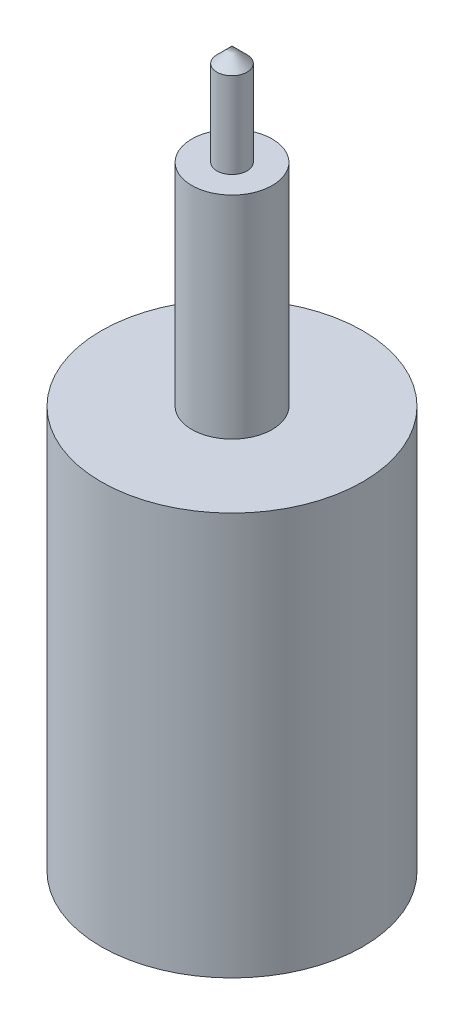
ISO-10303-21;
HEADER;
FILE_DESCRIPTION(('STEP AP214'),'2;1');
FILE_NAME('part.step','',(''),(''),'','','');
FILE_SCHEMA(('AUTOMOTIVE_DESIGN { 1 0 10303 214 1 1 1 1 }'));
ENDSEC;
DATA;
#1=APPLICATION_CONTEXT('core data for automotive mechanical design processes');
#2=APPLICATION_PROTOCOL_DEFINITION('international standard','automotive_design',2000,#1);
#3=PRODUCT_CONTEXT('',#1,'mechanical');
#4=PRODUCT('Part','Part','',(#3));
#5=PRODUCT_RELATED_PRODUCT_CATEGORY('part','',(#4));
#6=PRODUCT_DEFINITION_FORMATION('','',#4);
#7=PRODUCT_DEFINITION_CONTEXT('part definition',#1,'design');
#8=PRODUCT_DEFINITION('design','',#6,#7);
#9=PRODUCT_DEFINITION_SHAPE('','',#8);
#10=(LENGTH_UNIT() NAMED_UNIT(*) SI_UNIT(.MILLI.,.METRE.));
#11=(NAMED_UNIT(*) PLANE_ANGLE_UNIT() SI_UNIT($,.RADIAN.));
#12=(NAMED_UNIT(*) SI_UNIT($,.STERADIAN.) SOLID_ANGLE_UNIT());
#13=UNCERTAINTY_MEASURE_WITH_UNIT(LENGTH_MEASURE(1.E-05),#10,'distance_accuracy_value','');
#14=(GEOMETRIC_REPRESENTATION_CONTEXT(3) GLOBAL_UNCERTAINTY_ASSIGNED_CONTEXT((#13)) GLOBAL_UNIT_ASSIGNED_CONTEXT((#10,
#11,#12)) REPRESENTATION_CONTEXT('',''));
#15=CARTESIAN_POINT('',(0.,0.,0.));
#16=DIRECTION('',(0.,0.,1.));
#17=DIRECTION('',(1.,0.,0.));
#18=AXIS2_PLACEMENT_3D('',#15,#16,#17);
#19=CARTESIAN_POINT('',(0.,122.,0.));
#20=DIRECTION('',(0.,1.,0.));
#21=DIRECTION('',(0.,0.,1.));
#22=AXIS2_PLACEMENT_3D('',#19,#20,#21);
#23=PLANE('',#22);
#24=CARTESIAN_POINT('',(0.,122.,0.));
#25=DIRECTION('',(0.,1.,0.));
#26=DIRECTION('',(0.,0.,1.));
#27=AXIS2_PLACEMENT_3D('',#24,#25,#26);
#28=CIRCLE('',#27,8.);
#29=CARTESIAN_POINT('',(0.,122.,-8.));
#30=VERTEX_POINT('',#29);
#31=EDGE_CURVE('E81',#30,#30,#28,.T.);
#32=ORIENTED_EDGE('',*,*,#31,.T.);
#33=EDGE_LOOP('',(#32));
#34=FACE_BOUND('',#33,.T.);
#35=CARTESIAN_POINT('',(0.,122.,0.));
#36=DIRECTION('',(0.,1.,0.));
#37=DIRECTION('',(0.,0.,1.));
#38=AXIS2_PLACEMENT_3D('',#35,#36,#37);
#39=CIRCLE('',#38,3.);
#40=CARTESIAN_POINT('',(0.,122.,3.));
#41=VERTEX_POINT('',#40);
#42=EDGE_CURVE('E87',#41,#41,#39,.T.);
#43=ORIENTED_EDGE('',*,*,#42,.F.);
#44=EDGE_LOOP('',(#43));
#45=FACE_BOUND('',#44,.T.);
#46=ADVANCED_FACE('F32',(#34,#45),#23,.T.);
#47=CARTESIAN_POINT('',(0.,80.,0.));
#48=DIRECTION('',(0.,1.,0.));
#49=DIRECTION('',(0.,0.,1.));
#50=AXIS2_PLACEMENT_3D('',#47,#48,#49);
#51=PLANE('',#50);
#52=CARTESIAN_POINT('',(0.,80.,0.));
#53=DIRECTION('',(0.,1.,0.));
#54=DIRECTION('',(0.,0.,1.));
#55=AXIS2_PLACEMENT_3D('',#52,#53,#54);
#56=CIRCLE('',#55,26.);
#57=CARTESIAN_POINT('',(0.,80.,26.));
#58=VERTEX_POINT('',#57);
#59=EDGE_CURVE('E39',#58,#58,#56,.T.);
#60=ORIENTED_EDGE('',*,*,#59,.T.);
#61=EDGE_LOOP('',(#60));
#62=FACE_BOUND('',#61,.T.);
#63=CARTESIAN_POINT('',(0.,80.,0.));
#64=DIRECTION('',(0.,1.,0.));
#65=DIRECTION('',(0.,0.,1.));
#66=AXIS2_PLACEMENT_3D('',#63,#64,#65);
#67=CIRCLE('',#66,8.);
#68=CARTESIAN_POINT('',(0.,80.,-8.));
#69=VERTEX_POINT('',#68);
#70=EDGE_CURVE('E83',#69,#69,#67,.T.);
#71=ORIENTED_EDGE('',*,*,#70,.F.);
#72=EDGE_LOOP('',(#71));
#73=FACE_BOUND('',#72,.T.);
#74=ADVANCED_FACE('F53',(#62,#73),#51,.T.);
#75=CARTESIAN_POINT('',(0.,80.,0.));
#76=DIRECTION('',(0.,-1.,0.));
#77=DIRECTION('',(0.,0.,-1.));
#78=AXIS2_PLACEMENT_3D('',#75,#76,#77);
#79=CYLINDRICAL_SURFACE('',#78,26.);
#80=ORIENTED_EDGE('',*,*,#59,.F.);
#81=EDGE_LOOP('',(#80));
#82=FACE_BOUND('',#81,.T.);
#83=CARTESIAN_POINT('',(0.,0.,0.));
#84=DIRECTION('',(0.,1.,0.));
#85=DIRECTION('',(0.,0.,1.));
#86=AXIS2_PLACEMENT_3D('',#83,#84,#85);
#87=CIRCLE('',#86,26.);
#88=CARTESIAN_POINT('',(0.,0.,26.));
#89=VERTEX_POINT('',#88);
#90=EDGE_CURVE('E80',#89,#89,#87,.T.);
#91=ORIENTED_EDGE('',*,*,#90,.T.);
#92=EDGE_LOOP('',(#91));
#93=FACE_BOUND('',#92,.T.);
#94=ADVANCED_FACE('F59',(#82,#93),#79,.T.);
#95=CARTESIAN_POINT('',(0.,0.,0.));
#96=DIRECTION('',(0.,1.,0.));
#97=DIRECTION('',(0.,0.,1.));
#98=AXIS2_PLACEMENT_3D('',#95,#96,#97);
#99=PLANE('',#98);
#100=ORIENTED_EDGE('',*,*,#90,.F.);
#101=EDGE_LOOP('',(#100));
#102=FACE_BOUND('',#101,.T.);
#103=ADVANCED_FACE('F66',(#102),#99,.F.);
#104=CARTESIAN_POINT('',(0.,122.,0.));
#105=DIRECTION('',(0.,-1.,0.));
#106=DIRECTION('',(0.,0.,-1.));
#107=AXIS2_PLACEMENT_3D('',#104,#105,#106);
#108=CYLINDRICAL_SURFACE('',#107,8.);
#109=CARTESIAN_POINT('',(0.,122.,-8.));
#110=CARTESIAN_POINT('',(0.,121.5625,-8.));
#111=CARTESIAN_POINT('',(0.,121.125,-8.));
#112=CARTESIAN_POINT('',(0.,120.25,-8.));
#113=CARTESIAN_POINT('',(0.,119.8125,-8.));
#114=CARTESIAN_POINT('',(0.,118.9375,-8.));
#115=CARTESIAN_POINT('',(0.,118.5,-8.));
#116=CARTESIAN_POINT('',(0.,117.625,-8.));
#117=CARTESIAN_POINT('',(0.,117.1875,-8.));
#118=CARTESIAN_POINT('',(0.,116.3125,-8.));
#119=CARTESIAN_POINT('',(0.,115.875,-8.));
#120=CARTESIAN_POINT('',(0.,115.,-8.));
#121=CARTESIAN_POINT('',(0.,114.5625,-8.));
#122=CARTESIAN_POINT('',(0.,113.6875,-8.));
#123=CARTESIAN_POINT('',(0.,113.25,-8.));
#124=CARTESIAN_POINT('',(0.,112.375,-8.));
#125=CARTESIAN_POINT('',(0.,111.9375,-8.));
#126=CARTESIAN_POINT('',(0.,111.0625,-8.));
#127=CARTESIAN_POINT('',(0.,110.625,-8.));
#128=CARTESIAN_POINT('',(0.,109.75,-8.));
#129=CARTESIAN_POINT('',(0.,109.3125,-8.));
#130=CARTESIAN_POINT('',(0.,108.4375,-8.));
#131=CARTESIAN_POINT('',(0.,108.,-8.));
#132=CARTESIAN_POINT('',(0.,107.125,-8.));
#133=CARTESIAN_POINT('',(0.,106.6875,-8.));
#134=CARTESIAN_POINT('',(0.,105.8125,-8.));
#135=CARTESIAN_POINT('',(0.,105.375,-8.));
#136=CARTESIAN_POINT('',(0.,104.5,-8.));
#137=CARTESIAN_POINT('',(0.,104.0625,-8.));
#138=CARTESIAN_POINT('',(0.,103.1875,-8.));
#139=CARTESIAN_POINT('',(0.,102.75,-8.));
#140=CARTESIAN_POINT('',(0.,101.875,-8.));
#141=CARTESIAN_POINT('',(0.,101.4375,-8.));
#142=CARTESIAN_POINT('',(0.,100.5625,-8.));
#143=CARTESIAN_POINT('',(0.,100.125,-8.));
#144=CARTESIAN_POINT('',(0.,99.25,-8.));
#145=CARTESIAN_POINT('',(0.,98.8125,-8.));
#146=CARTESIAN_POINT('',(0.,97.9375,-8.));
#147=CARTESIAN_POINT('',(0.,97.5,-8.));
#148=CARTESIAN_POINT('',(0.,96.625,-8.));
#149=CARTESIAN_POINT('',(0.,96.1875,-8.));
#150=CARTESIAN_POINT('',(0.,95.3125,-8.));
#151=CARTESIAN_POINT('',(0.,94.875,-8.));
#152=CARTESIAN_POINT('',(0.,94.,-8.));
#153=CARTESIAN_POINT('',(0.,93.5625,-8.));
#154=CARTESIAN_POINT('',(0.,92.6875,-8.));
#155=CARTESIAN_POINT('',(0.,92.25,-8.));
#156=CARTESIAN_POINT('',(0.,91.375,-8.));
#157=CARTESIAN_POINT('',(0.,90.9375,-8.));
#158=CARTESIAN_POINT('',(0.,90.0625,-8.));
#159=CARTESIAN_POINT('',(0.,89.625,-8.));
#160=CARTESIAN_POINT('',(0.,88.75,-8.));
#161=CARTESIAN_POINT('',(0.,88.3125,-8.));
#162=CARTESIAN_POINT('',(0.,87.4375,-8.));
#163=CARTESIAN_POINT('',(0.,87.,-8.));
#164=CARTESIAN_POINT('',(0.,86.125,-8.));
#165=CARTESIAN_POINT('',(0.,85.6875,-8.));
#166=CARTESIAN_POINT('',(0.,84.8125,-8.));
#167=CARTESIAN_POINT('',(0.,84.375,-8.));
#168=CARTESIAN_POINT('',(0.,83.5,-8.));
#169=CARTESIAN_POINT('',(0.,83.0625,-8.));
#170=CARTESIAN_POINT('',(0.,82.1875,-8.));
#171=CARTESIAN_POINT('',(0.,81.75,-8.));
#172=CARTESIAN_POINT('',(0.,80.875,-8.));
#173=CARTESIAN_POINT('',(0.,80.4375,-8.));
#174=CARTESIAN_POINT('',(0.,80.,-8.));
#175=B_SPLINE_CURVE_WITH_KNOTS('',3,(#109,#110,#111,#112,#113,#114,#115,#116,#117,#118,#119,
#120,#121,#122,#123,#124,#125,#126,#127,#128,#129,#130,#131,#132,#133,#134,#135,#136,#137,#138,
#139,#140,#141,#142,#143,#144,#145,#146,#147,#148,#149,#150,#151,#152,#153,#154,#155,#156,#157,
#158,#159,#160,#161,#162,#163,#164,#165,#166,#167,#168,#169,#170,#171,#172,#173,#174),
.UNSPECIFIED.,.F.,.F.,(4,2,2,2,2,2,2,2,2,2,2,2,2,2,2,2,2,2,2,2,2,2,2,2,2,2,2,2,2,2,2,2,4),(0.,
1.31250000000001,2.625,3.93750000000001,5.25,6.56250000000001,7.87500000000001,9.1875,10.5,
11.8125,13.125,14.4375,15.75,17.0625,18.375,19.6875,21.,22.3125,23.625,24.9375,26.25,27.5625,
28.875,30.1875,31.5,32.8125,34.125,35.4375,36.75,38.0625,39.375,40.6875,42.),.UNSPECIFIED.);
#176=EDGE_CURVE('BSEAM48',#30,#69,#175,.T.);
#177=ORIENTED_EDGE('',*,*,#31,.F.);
#178=ORIENTED_EDGE('',*,*,#70,.T.);
#179=ORIENTED_EDGE('',*,*,#176,.T.);
#180=ORIENTED_EDGE('',*,*,#176,.F.);
#181=EDGE_LOOP('',(#177,#179,#178,#180));
#182=FACE_BOUND('',#181,.T.);
#183=ADVANCED_FACE('F48',(#182),#108,.T.);
#184=CARTESIAN_POINT('',(0.,142.,0.));
#185=DIRECTION('',(0.,-1.,0.));
#186=DIRECTION('',(0.,0.,-1.));
#187=AXIS2_PLACEMENT_3D('',#184,#185,#186);
#188=CYLINDRICAL_SURFACE('',#187,3.);
#189=CARTESIAN_POINT('',(0.,139.,0.));
#190=DIRECTION('',(0.,1.,0.));
#191=DIRECTION('',(0.,0.,1.));
#192=AXIS2_PLACEMENT_3D('',#189,#190,#191);
#193=CIRCLE('',#192,3.);
#194=CARTESIAN_POINT('',(0.,139.,3.));
#195=VERTEX_POINT('',#194);
#196=EDGE_CURVE('E11',#195,#195,#193,.F.);
#197=ORIENTED_EDGE('',*,*,#196,.T.);
#198=EDGE_LOOP('',(#197));
#199=FACE_BOUND('',#198,.T.);
#200=ORIENTED_EDGE('',*,*,#42,.T.);
#201=EDGE_LOOP('',(#200));
#202=FACE_BOUND('',#201,.T.);
#203=ADVANCED_FACE('F43',(#199,#202),#188,.T.);
#204=CARTESIAN_POINT('',(0.,139.,0.));
#205=DIRECTION('',(0.,-1.,0.));
#206=DIRECTION('',(0.,0.,-1.));
#207=AXIS2_PLACEMENT_3D('',#204,#205,#206);
#208=CONICAL_SURFACE('',#207,3.,0.785398163397448);
#209=ORIENTED_EDGE('',*,*,#196,.F.);
#210=EDGE_LOOP('',(#209));
#211=FACE_BOUND('',#210,.T.);
#212=CARTESIAN_POINT('',(0.,142.,0.));
#213=VERTEX_POINT('',#212);
#214=VERTEX_LOOP('',#213);
#215=FACE_BOUND('',#214,.T.);
#216=ADVANCED_FACE('F34',(#211,#215),#208,.T.);
#217=CLOSED_SHELL('',(#46,#74,#94,#103,#183,#203,#216));
#218=MANIFOLD_SOLID_BREP('B2',#217);
#219=ADVANCED_BREP_SHAPE_REPRESENTATION('',(#18,#218),#14);
#220=SHAPE_DEFINITION_REPRESENTATION(#9,#219);
ENDSEC;
END-ISO-10303-21;
